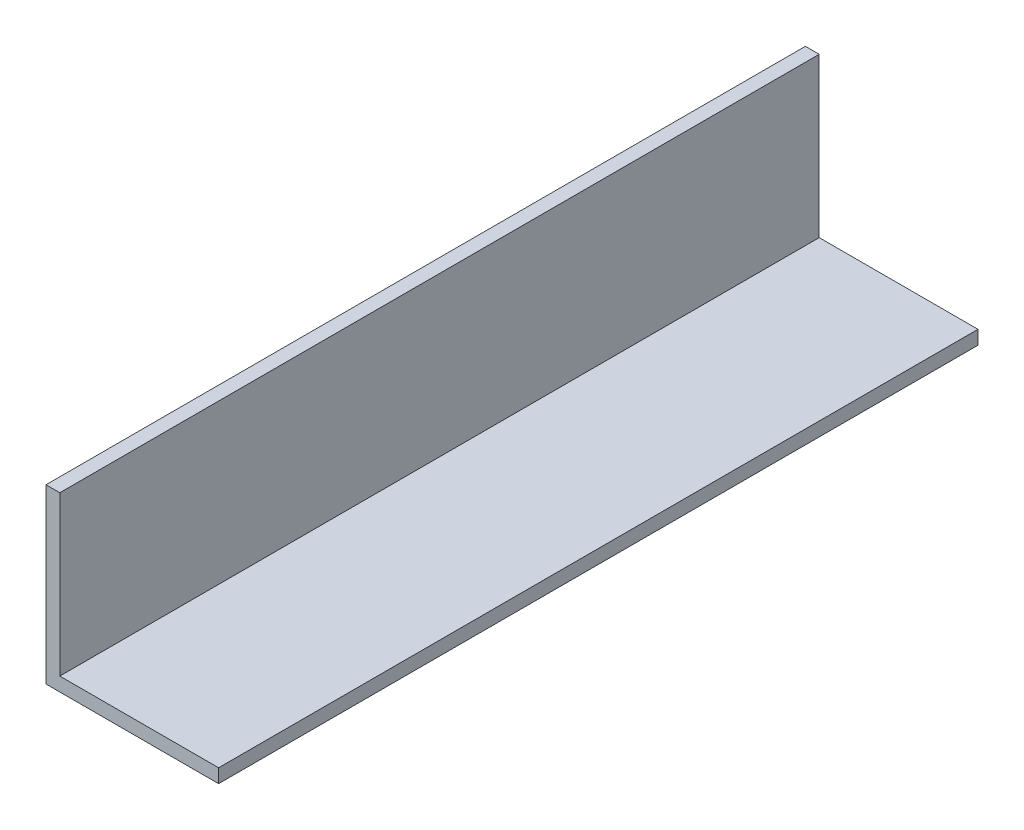
ISO-10303-21;
HEADER;
FILE_DESCRIPTION(('STEP AP214'),'2;1');
FILE_NAME('part.step','',(''),(''),'','','');
FILE_SCHEMA(('AUTOMOTIVE_DESIGN { 1 0 10303 214 1 1 1 1 }'));
ENDSEC;
DATA;
#1=APPLICATION_CONTEXT('core data for automotive mechanical design processes');
#2=APPLICATION_PROTOCOL_DEFINITION('international standard','automotive_design',2000,#1);
#3=PRODUCT_CONTEXT('',#1,'mechanical');
#4=PRODUCT('Part','Part','',(#3));
#5=PRODUCT_RELATED_PRODUCT_CATEGORY('part','',(#4));
#6=PRODUCT_DEFINITION_FORMATION('','',#4);
#7=PRODUCT_DEFINITION_CONTEXT('part definition',#1,'design');
#8=PRODUCT_DEFINITION('design','',#6,#7);
#9=PRODUCT_DEFINITION_SHAPE('','',#8);
#10=(LENGTH_UNIT() NAMED_UNIT(*) SI_UNIT(.MILLI.,.METRE.));
#11=(NAMED_UNIT(*) PLANE_ANGLE_UNIT() SI_UNIT($,.RADIAN.));
#12=(NAMED_UNIT(*) SI_UNIT($,.STERADIAN.) SOLID_ANGLE_UNIT());
#13=UNCERTAINTY_MEASURE_WITH_UNIT(LENGTH_MEASURE(1.E-05),#10,'distance_accuracy_value','');
#14=(GEOMETRIC_REPRESENTATION_CONTEXT(3) GLOBAL_UNCERTAINTY_ASSIGNED_CONTEXT((#13)) GLOBAL_UNIT_ASSIGNED_CONTEXT((#10,
#11,#12)) REPRESENTATION_CONTEXT('',''));
#15=CARTESIAN_POINT('',(0.,0.,0.));
#16=DIRECTION('',(0.,0.,1.));
#17=DIRECTION('',(1.,0.,0.));
#18=AXIS2_PLACEMENT_3D('',#15,#16,#17);
#19=CARTESIAN_POINT('',(0.,25.,110.));
#20=DIRECTION('',(1.,0.,0.));
#21=DIRECTION('',(0.,0.,-1.));
#22=AXIS2_PLACEMENT_3D('',#19,#20,#21);
#23=PLANE('',#22);
#24=DIRECTION('',(0.,-1.,0.));
#25=VECTOR('',#24,1.);
#26=CARTESIAN_POINT('',(0.,25.,0.));
#27=LINE('',#26,#25);
#28=CARTESIAN_POINT('',(0.,25.,0.));
#29=VERTEX_POINT('',#28);
#30=CARTESIAN_POINT('',(0.,0.,0.));
#31=VERTEX_POINT('',#30);
#32=EDGE_CURVE('E128',#29,#31,#27,.T.);
#33=ORIENTED_EDGE('',*,*,#32,.T.);
#34=DIRECTION('',(0.,0.,-1.));
#35=VECTOR('',#34,1.);
#36=CARTESIAN_POINT('',(0.,0.,110.));
#37=LINE('',#36,#35);
#38=CARTESIAN_POINT('',(0.,0.,110.));
#39=VERTEX_POINT('',#38);
#40=EDGE_CURVE('E11',#39,#31,#37,.T.);
#41=ORIENTED_EDGE('',*,*,#40,.F.);
#42=DIRECTION('',(0.,-1.,0.));
#43=VECTOR('',#42,1.);
#44=CARTESIAN_POINT('',(0.,25.,110.));
#45=LINE('',#44,#43);
#46=CARTESIAN_POINT('',(0.,25.,110.));
#47=VERTEX_POINT('',#46);
#48=EDGE_CURVE('E144',#47,#39,#45,.T.);
#49=ORIENTED_EDGE('',*,*,#48,.F.);
#50=DIRECTION('',(0.,0.,-1.));
#51=VECTOR('',#50,1.);
#52=CARTESIAN_POINT('',(0.,25.,110.));
#53=LINE('',#52,#51);
#54=EDGE_CURVE('E124',#47,#29,#53,.T.);
#55=ORIENTED_EDGE('',*,*,#54,.T.);
#56=EDGE_LOOP('',(#33,#41,#49,#55));
#57=FACE_BOUND('',#56,.T.);
#58=ADVANCED_FACE('F39',(#57),#23,.F.);
#59=CARTESIAN_POINT('',(0.,0.,110.));
#60=DIRECTION('',(0.,1.,0.));
#61=DIRECTION('',(0.,0.,1.));
#62=AXIS2_PLACEMENT_3D('',#59,#60,#61);
#63=PLANE('',#62);
#64=DIRECTION('',(1.,0.,0.));
#65=VECTOR('',#64,1.);
#66=CARTESIAN_POINT('',(0.,0.,0.));
#67=LINE('',#66,#65);
#68=CARTESIAN_POINT('',(25.,0.,0.));
#69=VERTEX_POINT('',#68);
#70=EDGE_CURVE('E132',#31,#69,#67,.T.);
#71=ORIENTED_EDGE('',*,*,#70,.T.);
#72=DIRECTION('',(0.,0.,-1.));
#73=VECTOR('',#72,1.);
#74=CARTESIAN_POINT('',(25.,0.,110.));
#75=LINE('',#74,#73);
#76=CARTESIAN_POINT('',(25.,0.,110.));
#77=VERTEX_POINT('',#76);
#78=EDGE_CURVE('E48',#77,#69,#75,.T.);
#79=ORIENTED_EDGE('',*,*,#78,.F.);
#80=DIRECTION('',(1.,0.,0.));
#81=VECTOR('',#80,1.);
#82=CARTESIAN_POINT('',(0.,0.,110.));
#83=LINE('',#82,#81);
#84=EDGE_CURVE('E93',#39,#77,#83,.T.);
#85=ORIENTED_EDGE('',*,*,#84,.F.);
#86=ORIENTED_EDGE('',*,*,#40,.T.);
#87=EDGE_LOOP('',(#71,#79,#85,#86));
#88=FACE_BOUND('',#87,.T.);
#89=ADVANCED_FACE('F172',(#88),#63,.F.);
#90=CARTESIAN_POINT('',(25.,0.,110.));
#91=DIRECTION('',(-1.,0.,0.));
#92=DIRECTION('',(0.,0.,1.));
#93=AXIS2_PLACEMENT_3D('',#90,#91,#92);
#94=PLANE('',#93);
#95=DIRECTION('',(0.,1.,0.));
#96=VECTOR('',#95,1.);
#97=CARTESIAN_POINT('',(25.,0.,0.));
#98=LINE('',#97,#96);
#99=CARTESIAN_POINT('',(25.,2.,0.));
#100=VERTEX_POINT('',#99);
#101=EDGE_CURVE('E135',#69,#100,#98,.T.);
#102=ORIENTED_EDGE('',*,*,#101,.T.);
#103=DIRECTION('',(0.,0.,-1.));
#104=VECTOR('',#103,1.);
#105=CARTESIAN_POINT('',(25.,2.,110.));
#106=LINE('',#105,#104);
#107=CARTESIAN_POINT('',(25.,2.,110.));
#108=VERTEX_POINT('',#107);
#109=EDGE_CURVE('E117',#108,#100,#106,.T.);
#110=ORIENTED_EDGE('',*,*,#109,.F.);
#111=DIRECTION('',(0.,1.,0.));
#112=VECTOR('',#111,1.);
#113=CARTESIAN_POINT('',(25.,0.,110.));
#114=LINE('',#113,#112);
#115=EDGE_CURVE('E106',#77,#108,#114,.T.);
#116=ORIENTED_EDGE('',*,*,#115,.F.);
#117=ORIENTED_EDGE('',*,*,#78,.T.);
#118=EDGE_LOOP('',(#102,#110,#116,#117));
#119=FACE_BOUND('',#118,.T.);
#120=ADVANCED_FACE('F154',(#119),#94,.F.);
#121=CARTESIAN_POINT('',(25.,2.,110.));
#122=DIRECTION('',(0.,-1.,0.));
#123=DIRECTION('',(1.,0.,0.));
#124=AXIS2_PLACEMENT_3D('',#121,#122,#123);
#125=PLANE('',#124);
#126=DIRECTION('',(-1.,0.,0.));
#127=VECTOR('',#126,1.);
#128=CARTESIAN_POINT('',(25.,2.,0.));
#129=LINE('',#128,#127);
#130=CARTESIAN_POINT('',(2.,2.,0.));
#131=VERTEX_POINT('',#130);
#132=EDGE_CURVE('E115',#100,#131,#129,.T.);
#133=ORIENTED_EDGE('',*,*,#132,.T.);
#134=DIRECTION('',(0.,0.,-1.));
#135=VECTOR('',#134,1.);
#136=CARTESIAN_POINT('',(2.,2.,110.));
#137=LINE('',#136,#135);
#138=CARTESIAN_POINT('',(2.,2.,110.));
#139=VERTEX_POINT('',#138);
#140=EDGE_CURVE('E112',#139,#131,#137,.T.);
#141=ORIENTED_EDGE('',*,*,#140,.F.);
#142=DIRECTION('',(-1.,0.,0.));
#143=VECTOR('',#142,1.);
#144=CARTESIAN_POINT('',(25.,2.,110.));
#145=LINE('',#144,#143);
#146=EDGE_CURVE('E100',#108,#139,#145,.T.);
#147=ORIENTED_EDGE('',*,*,#146,.F.);
#148=ORIENTED_EDGE('',*,*,#109,.T.);
#149=EDGE_LOOP('',(#133,#141,#147,#148));
#150=FACE_BOUND('',#149,.T.);
#151=ADVANCED_FACE('F113',(#150),#125,.F.);
#152=CARTESIAN_POINT('',(2.,2.,110.));
#153=DIRECTION('',(-1.,0.,0.));
#154=DIRECTION('',(0.,-1.,0.));
#155=AXIS2_PLACEMENT_3D('',#152,#153,#154);
#156=PLANE('',#155);
#157=DIRECTION('',(0.,1.,0.));
#158=VECTOR('',#157,1.);
#159=CARTESIAN_POINT('',(2.,2.,0.));
#160=LINE('',#159,#158);
#161=CARTESIAN_POINT('',(2.,25.,0.));
#162=VERTEX_POINT('',#161);
#163=EDGE_CURVE('E79',#131,#162,#160,.T.);
#164=ORIENTED_EDGE('',*,*,#163,.T.);
#165=DIRECTION('',(0.,0.,-1.));
#166=VECTOR('',#165,1.);
#167=CARTESIAN_POINT('',(2.,25.,110.));
#168=LINE('',#167,#166);
#169=CARTESIAN_POINT('',(2.,25.,110.));
#170=VERTEX_POINT('',#169);
#171=EDGE_CURVE('E118',#170,#162,#168,.T.);
#172=ORIENTED_EDGE('',*,*,#171,.F.);
#173=DIRECTION('',(0.,1.,0.));
#174=VECTOR('',#173,1.);
#175=CARTESIAN_POINT('',(2.,2.,110.));
#176=LINE('',#175,#174);
#177=EDGE_CURVE('E104',#139,#170,#176,.T.);
#178=ORIENTED_EDGE('',*,*,#177,.F.);
#179=ORIENTED_EDGE('',*,*,#140,.T.);
#180=EDGE_LOOP('',(#164,#172,#178,#179));
#181=FACE_BOUND('',#180,.T.);
#182=ADVANCED_FACE('F120',(#181),#156,.F.);
#183=CARTESIAN_POINT('',(2.,25.,110.));
#184=DIRECTION('',(0.,-1.,0.));
#185=DIRECTION('',(0.,0.,-1.));
#186=AXIS2_PLACEMENT_3D('',#183,#184,#185);
#187=PLANE('',#186);
#188=DIRECTION('',(-1.,0.,0.));
#189=VECTOR('',#188,1.);
#190=CARTESIAN_POINT('',(2.,25.,0.));
#191=LINE('',#190,#189);
#192=EDGE_CURVE('E85',#162,#29,#191,.T.);
#193=ORIENTED_EDGE('',*,*,#192,.T.);
#194=ORIENTED_EDGE('',*,*,#54,.F.);
#195=DIRECTION('',(-1.,0.,0.));
#196=VECTOR('',#195,1.);
#197=CARTESIAN_POINT('',(2.,25.,110.));
#198=LINE('',#197,#196);
#199=EDGE_CURVE('E56',#170,#47,#198,.T.);
#200=ORIENTED_EDGE('',*,*,#199,.F.);
#201=ORIENTED_EDGE('',*,*,#171,.T.);
#202=EDGE_LOOP('',(#193,#194,#200,#201));
#203=FACE_BOUND('',#202,.T.);
#204=ADVANCED_FACE('F161',(#203),#187,.F.);
#205=CARTESIAN_POINT('',(0.,0.,110.));
#206=DIRECTION('',(0.,0.,1.));
#207=DIRECTION('',(1.,0.,0.));
#208=AXIS2_PLACEMENT_3D('',#205,#206,#207);
#209=PLANE('',#208);
#210=ORIENTED_EDGE('',*,*,#48,.T.);
#211=ORIENTED_EDGE('',*,*,#84,.T.);
#212=ORIENTED_EDGE('',*,*,#115,.T.);
#213=ORIENTED_EDGE('',*,*,#146,.T.);
#214=ORIENTED_EDGE('',*,*,#177,.T.);
#215=ORIENTED_EDGE('',*,*,#199,.T.);
#216=EDGE_LOOP('',(#210,#211,#212,#213,#214,#215));
#217=FACE_BOUND('',#216,.T.);
#218=ADVANCED_FACE('F102',(#217),#209,.T.);
#219=CARTESIAN_POINT('',(0.,0.,0.));
#220=DIRECTION('',(0.,0.,1.));
#221=DIRECTION('',(1.,0.,0.));
#222=AXIS2_PLACEMENT_3D('',#219,#220,#221);
#223=PLANE('',#222);
#224=ORIENTED_EDGE('',*,*,#32,.F.);
#225=ORIENTED_EDGE('',*,*,#192,.F.);
#226=ORIENTED_EDGE('',*,*,#163,.F.);
#227=ORIENTED_EDGE('',*,*,#132,.F.);
#228=ORIENTED_EDGE('',*,*,#101,.F.);
#229=ORIENTED_EDGE('',*,*,#70,.F.);
#230=EDGE_LOOP('',(#224,#225,#226,#227,#228,#229));
#231=FACE_BOUND('',#230,.T.);
#232=ADVANCED_FACE('F157',(#231),#223,.F.);
#233=CLOSED_SHELL('',(#58,#89,#120,#151,#182,#204,#218,#232));
#234=MANIFOLD_SOLID_BREP('B2',#233);
#235=ADVANCED_BREP_SHAPE_REPRESENTATION('',(#18,#234),#14);
#236=SHAPE_DEFINITION_REPRESENTATION(#9,#235);
ENDSEC;
END-ISO-10303-21;
